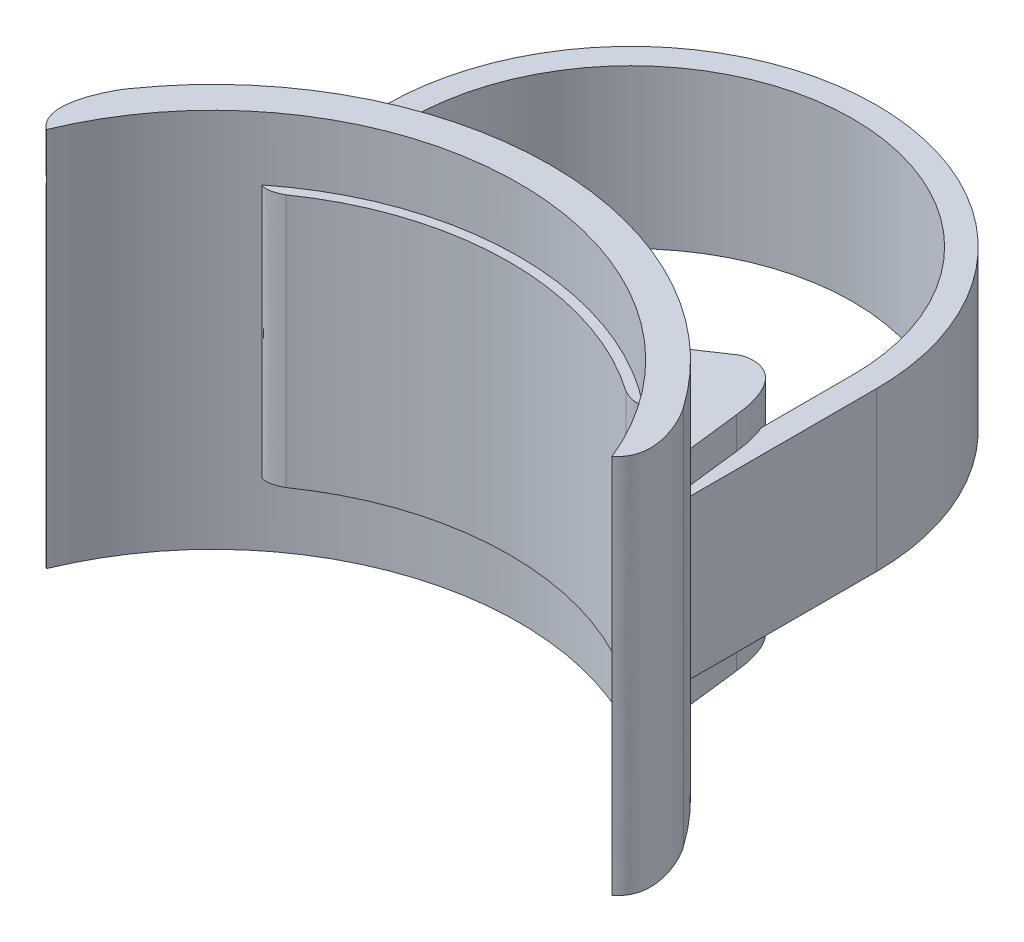
ISO-10303-21;
HEADER;
FILE_DESCRIPTION(('STEP AP214'),'2;1');
FILE_NAME('part.step','',(''),(''),'','','');
FILE_SCHEMA(('AUTOMOTIVE_DESIGN { 1 0 10303 214 1 1 1 1 }'));
ENDSEC;
DATA;
#1=APPLICATION_CONTEXT('core data for automotive mechanical design processes');
#2=APPLICATION_PROTOCOL_DEFINITION('international standard','automotive_design',2000,#1);
#3=PRODUCT_CONTEXT('',#1,'mechanical');
#4=PRODUCT('Part','Part','',(#3));
#5=PRODUCT_RELATED_PRODUCT_CATEGORY('part','',(#4));
#6=PRODUCT_DEFINITION_FORMATION('','',#4);
#7=PRODUCT_DEFINITION_CONTEXT('part definition',#1,'design');
#8=PRODUCT_DEFINITION('design','',#6,#7);
#9=PRODUCT_DEFINITION_SHAPE('','',#8);
#10=(LENGTH_UNIT() NAMED_UNIT(*) SI_UNIT(.MILLI.,.METRE.));
#11=(NAMED_UNIT(*) PLANE_ANGLE_UNIT() SI_UNIT($,.RADIAN.));
#12=(NAMED_UNIT(*) SI_UNIT($,.STERADIAN.) SOLID_ANGLE_UNIT());
#13=UNCERTAINTY_MEASURE_WITH_UNIT(LENGTH_MEASURE(1.E-05),#10,'distance_accuracy_value','');
#14=(GEOMETRIC_REPRESENTATION_CONTEXT(3) GLOBAL_UNCERTAINTY_ASSIGNED_CONTEXT((#13)) GLOBAL_UNIT_ASSIGNED_CONTEXT((#10,
#11,#12)) REPRESENTATION_CONTEXT('',''));
#15=CARTESIAN_POINT('',(0.,0.,0.));
#16=DIRECTION('',(0.,0.,1.));
#17=DIRECTION('',(1.,0.,0.));
#18=AXIS2_PLACEMENT_3D('',#15,#16,#17);
#19=CARTESIAN_POINT('',(0.,6.,0.));
#20=DIRECTION('',(0.,-1.,0.));
#21=DIRECTION('',(0.,0.,-1.));
#22=AXIS2_PLACEMENT_3D('',#19,#20,#21);
#23=CYLINDRICAL_SURFACE('',#22,9.65);
#24=CARTESIAN_POINT('',(0.,-6.,0.));
#25=DIRECTION('',(0.,-1.,0.));
#26=DIRECTION('',(0.,0.,1.));
#27=AXIS2_PLACEMENT_3D('',#24,#25,#26);
#28=CIRCLE('',#27,9.65);
#29=CARTESIAN_POINT('',(-8.92789337007722,-6.,-3.66267934339483));
#30=VERTEX_POINT('',#29);
#31=CARTESIAN_POINT('',(8.92789337007722,-6.,-3.66267934339483));
#32=VERTEX_POINT('',#31);
#33=EDGE_CURVE('E449',#30,#32,#28,.T.);
#34=ORIENTED_EDGE('',*,*,#33,.T.);
#35=DIRECTION('',(0.,-1.,0.));
#36=VECTOR('',#35,1.);
#37=CARTESIAN_POINT('',(8.92789337007722,6.,-3.66267934339483));
#38=LINE('',#37,#36);
#39=CARTESIAN_POINT('',(8.92789337007722,6.,-3.66267934339483));
#40=VERTEX_POINT('',#39);
#41=EDGE_CURVE('E448',#40,#32,#38,.T.);
#42=ORIENTED_EDGE('',*,*,#41,.F.);
#43=CARTESIAN_POINT('',(0.,6.,0.));
#44=DIRECTION('',(0.,-1.,0.));
#45=DIRECTION('',(0.,0.,1.));
#46=AXIS2_PLACEMENT_3D('',#43,#44,#45);
#47=CIRCLE('',#46,9.65);
#48=CARTESIAN_POINT('',(-8.92789337007722,6.,-3.66267934339483));
#49=VERTEX_POINT('',#48);
#50=EDGE_CURVE('E414',#49,#40,#47,.T.);
#51=ORIENTED_EDGE('',*,*,#50,.F.);
#52=DIRECTION('',(0.,-1.,0.));
#53=VECTOR('',#52,1.);
#54=CARTESIAN_POINT('',(-8.92789337007722,6.,-3.66267934339483));
#55=LINE('',#54,#53);
#56=EDGE_CURVE('E454',#49,#30,#55,.T.);
#57=ORIENTED_EDGE('',*,*,#56,.T.);
#58=EDGE_LOOP('',(#34,#42,#51,#57));
#59=FACE_BOUND('',#58,.T.);
#60=CARTESIAN_POINT('',(0.,4.,0.));
#61=DIRECTION('',(0.,1.,0.));
#62=DIRECTION('',(0.,0.,1.));
#63=AXIS2_PLACEMENT_3D('',#60,#61,#62);
#64=CIRCLE('',#63,9.65);
#65=CARTESIAN_POINT('',(6.01329510591382,4.,-7.54736920848536));
#66=VERTEX_POINT('',#65);
#67=CARTESIAN_POINT('',(-6.01329510591382,4.,-7.54736920848536));
#68=VERTEX_POINT('',#67);
#69=EDGE_CURVE('E66',#66,#68,#64,.T.);
#70=ORIENTED_EDGE('',*,*,#69,.F.);
#71=DIRECTION('',(0.,-1.,0.));
#72=VECTOR('',#71,1.);
#73=CARTESIAN_POINT('',(6.01329510591382,4.,-7.54736920848536));
#74=LINE('',#73,#72);
#75=CARTESIAN_POINT('',(6.01329510591382,-4.,-7.54736920848536));
#76=VERTEX_POINT('',#75);
#77=EDGE_CURVE('E257',#66,#76,#74,.T.);
#78=ORIENTED_EDGE('',*,*,#77,.T.);
#79=CARTESIAN_POINT('',(0.,-4.,0.));
#80=DIRECTION('',(0.,1.,0.));
#81=DIRECTION('',(0.,0.,1.));
#82=AXIS2_PLACEMENT_3D('',#79,#80,#81);
#83=CIRCLE('',#82,9.65);
#84=CARTESIAN_POINT('',(-6.01329510591382,-4.,-7.54736920848536));
#85=VERTEX_POINT('',#84);
#86=EDGE_CURVE('E246',#76,#85,#83,.T.);
#87=ORIENTED_EDGE('',*,*,#86,.T.);
#88=DIRECTION('',(0.,-1.,0.));
#89=VECTOR('',#88,1.);
#90=CARTESIAN_POINT('',(-6.01329510591381,4.,-7.54736920848536));
#91=LINE('',#90,#89);
#92=EDGE_CURVE('E65',#68,#85,#91,.T.);
#93=ORIENTED_EDGE('',*,*,#92,.F.);
#94=EDGE_LOOP('',(#70,#78,#87,#93));
#95=FACE_BOUND('',#94,.T.);
#96=ADVANCED_FACE('F42',(#59,#95),#23,.F.);
#97=CARTESIAN_POINT('',(0.,6.,0.));
#98=DIRECTION('',(0.,-1.,0.));
#99=DIRECTION('',(0.,0.,-1.));
#100=AXIS2_PLACEMENT_3D('',#97,#98,#99);
#101=CYLINDRICAL_SURFACE('',#100,10.65);
#102=CARTESIAN_POINT('',(0.,-6.,0.));
#103=DIRECTION('',(0.,1.,0.));
#104=DIRECTION('',(0.,0.,1.));
#105=AXIS2_PLACEMENT_3D('',#102,#103,#104);
#106=CIRCLE('',#105,10.65);
#107=CARTESIAN_POINT('',(8.72491438877498,-6.,-6.1072390577533));
#108=VERTEX_POINT('',#107);
#109=CARTESIAN_POINT('',(-8.72491438877497,-6.,-6.1072390577533));
#110=VERTEX_POINT('',#109);
#111=EDGE_CURVE('E416',#108,#110,#106,.T.);
#112=ORIENTED_EDGE('',*,*,#111,.T.);
#113=DIRECTION('',(0.,-1.,0.));
#114=VECTOR('',#113,1.);
#115=CARTESIAN_POINT('',(-8.72491438877497,6.,-6.1072390577533));
#116=LINE('',#115,#114);
#117=CARTESIAN_POINT('',(-8.72491438877497,6.,-6.1072390577533));
#118=VERTEX_POINT('',#117);
#119=EDGE_CURVE('E471',#118,#110,#116,.T.);
#120=ORIENTED_EDGE('',*,*,#119,.F.);
#121=CARTESIAN_POINT('',(0.,6.,0.));
#122=DIRECTION('',(0.,1.,0.));
#123=DIRECTION('',(0.,0.,1.));
#124=AXIS2_PLACEMENT_3D('',#121,#122,#123);
#125=CIRCLE('',#124,10.65);
#126=CARTESIAN_POINT('',(8.72491438877498,6.,-6.1072390577533));
#127=VERTEX_POINT('',#126);
#128=EDGE_CURVE('E428',#127,#118,#125,.T.);
#129=ORIENTED_EDGE('',*,*,#128,.F.);
#130=DIRECTION('',(0.,-1.,0.));
#131=VECTOR('',#130,1.);
#132=CARTESIAN_POINT('',(8.72491438877498,6.,-6.1072390577533));
#133=LINE('',#132,#131);
#134=EDGE_CURVE('E465',#127,#108,#133,.T.);
#135=ORIENTED_EDGE('',*,*,#134,.T.);
#136=EDGE_LOOP('',(#112,#120,#129,#135));
#137=FACE_BOUND('',#136,.T.);
#138=CARTESIAN_POINT('',(0.,3.5,0.));
#139=DIRECTION('',(0.,1.,0.));
#140=DIRECTION('',(0.,0.,1.));
#141=AXIS2_PLACEMENT_3D('',#138,#139,#140);
#142=CIRCLE('',#141,10.65);
#143=CARTESIAN_POINT('',(-4.05139613421545,3.5,-9.84929892752089));
#144=VERTEX_POINT('',#143);
#145=CARTESIAN_POINT('',(-7.44997939610248,3.5,-7.61053920544718));
#146=VERTEX_POINT('',#145);
#147=EDGE_CURVE('E575',#144,#146,#142,.T.);
#148=ORIENTED_EDGE('',*,*,#147,.T.);
#149=DIRECTION('',(0.,-1.,0.));
#150=VECTOR('',#149,1.);
#151=CARTESIAN_POINT('',(-7.44997939610248,3.5,-7.61053920544718));
#152=LINE('',#151,#150);
#153=CARTESIAN_POINT('',(-7.44997939610248,2.5,-7.61053920544718));
#154=VERTEX_POINT('',#153);
#155=EDGE_CURVE('E568',#146,#154,#152,.T.);
#156=ORIENTED_EDGE('',*,*,#155,.T.);
#157=CARTESIAN_POINT('',(0.,2.5,0.));
#158=DIRECTION('',(0.,1.,0.));
#159=DIRECTION('',(0.,0.,1.));
#160=AXIS2_PLACEMENT_3D('',#157,#158,#159);
#161=CIRCLE('',#160,10.65);
#162=CARTESIAN_POINT('',(-7.75,2.5,-7.30479294709987));
#163=VERTEX_POINT('',#162);
#164=EDGE_CURVE('E484',#154,#163,#161,.T.);
#165=ORIENTED_EDGE('',*,*,#164,.T.);
#166=DIRECTION('',(0.,-1.,0.));
#167=VECTOR('',#166,1.);
#168=CARTESIAN_POINT('',(-7.75,6.,-7.30479294709987));
#169=LINE('',#168,#167);
#170=CARTESIAN_POINT('',(-7.75,-2.5,-7.30479294709987));
#171=VERTEX_POINT('',#170);
#172=EDGE_CURVE('E481',#171,#163,#169,.F.);
#173=ORIENTED_EDGE('',*,*,#172,.F.);
#174=CARTESIAN_POINT('',(0.,-2.5,0.));
#175=DIRECTION('',(0.,1.,0.));
#176=DIRECTION('',(0.,0.,1.));
#177=AXIS2_PLACEMENT_3D('',#174,#175,#176);
#178=CIRCLE('',#177,10.65);
#179=CARTESIAN_POINT('',(-7.44997939610248,-2.5,-7.61053920544718));
#180=VERTEX_POINT('',#179);
#181=EDGE_CURVE('E478',#180,#171,#178,.T.);
#182=ORIENTED_EDGE('',*,*,#181,.F.);
#183=CARTESIAN_POINT('',(-7.44997939610248,-3.5,-7.61053920544718));
#184=VERTEX_POINT('',#183);
#185=EDGE_CURVE('E511',#180,#184,#152,.T.);
#186=ORIENTED_EDGE('',*,*,#185,.T.);
#187=CARTESIAN_POINT('',(0.,-3.5,0.));
#188=DIRECTION('',(0.,1.,0.));
#189=DIRECTION('',(0.,0.,1.));
#190=AXIS2_PLACEMENT_3D('',#187,#188,#189);
#191=CIRCLE('',#190,10.65);
#192=CARTESIAN_POINT('',(-4.05139613421545,-3.5,-9.84929892752089));
#193=VERTEX_POINT('',#192);
#194=EDGE_CURVE('E584',#193,#184,#191,.T.);
#195=ORIENTED_EDGE('',*,*,#194,.F.);
#196=DIRECTION('',(0.,-1.,0.));
#197=VECTOR('',#196,1.);
#198=CARTESIAN_POINT('',(-4.05139613421545,3.5,-9.84929892752089));
#199=LINE('',#198,#197);
#200=EDGE_CURVE('E574',#144,#193,#199,.T.);
#201=ORIENTED_EDGE('',*,*,#200,.F.);
#202=EDGE_LOOP('',(#148,#156,#165,#173,#182,#186,#195,#201));
#203=FACE_BOUND('',#202,.T.);
#204=DIRECTION('',(0.,-1.,0.));
#205=VECTOR('',#204,1.);
#206=CARTESIAN_POINT('',(7.44997939610248,3.5,-7.61053920544718));
#207=LINE('',#206,#205);
#208=CARTESIAN_POINT('',(7.44997939610248,3.5,-7.61053920544718));
#209=VERTEX_POINT('',#208);
#210=CARTESIAN_POINT('',(7.44997939610248,2.5,-7.61053920544718));
#211=VERTEX_POINT('',#210);
#212=EDGE_CURVE('E329',#209,#211,#207,.T.);
#213=ORIENTED_EDGE('',*,*,#212,.F.);
#214=CARTESIAN_POINT('',(0.,3.5,0.));
#215=DIRECTION('',(0.,1.,0.));
#216=DIRECTION('',(0.,0.,1.));
#217=AXIS2_PLACEMENT_3D('',#214,#215,#216);
#218=CIRCLE('',#217,10.65);
#219=CARTESIAN_POINT('',(4.05139613421545,3.5,-9.84929892752089));
#220=VERTEX_POINT('',#219);
#221=EDGE_CURVE('E313',#220,#209,#218,.F.);
#222=ORIENTED_EDGE('',*,*,#221,.F.);
#223=DIRECTION('',(0.,-1.,0.));
#224=VECTOR('',#223,1.);
#225=CARTESIAN_POINT('',(4.05139613421545,3.5,-9.84929892752089));
#226=LINE('',#225,#224);
#227=CARTESIAN_POINT('',(4.05139613421545,-3.5,-9.84929892752089));
#228=VERTEX_POINT('',#227);
#229=EDGE_CURVE('E332',#220,#228,#226,.T.);
#230=ORIENTED_EDGE('',*,*,#229,.T.);
#231=CARTESIAN_POINT('',(0.,-3.5,0.));
#232=DIRECTION('',(0.,1.,0.));
#233=DIRECTION('',(0.,0.,1.));
#234=AXIS2_PLACEMENT_3D('',#231,#232,#233);
#235=CIRCLE('',#234,10.65);
#236=CARTESIAN_POINT('',(7.44997939610248,-3.5,-7.61053920544718));
#237=VERTEX_POINT('',#236);
#238=EDGE_CURVE('E327',#228,#237,#235,.F.);
#239=ORIENTED_EDGE('',*,*,#238,.T.);
#240=CARTESIAN_POINT('',(7.44997939610248,-2.5,-7.61053920544718));
#241=VERTEX_POINT('',#240);
#242=EDGE_CURVE('E317',#241,#237,#207,.T.);
#243=ORIENTED_EDGE('',*,*,#242,.F.);
#244=CARTESIAN_POINT('',(7.75,-2.5,-7.30479294709987));
#245=VERTEX_POINT('',#244);
#246=EDGE_CURVE('E485',#245,#241,#178,.T.);
#247=ORIENTED_EDGE('',*,*,#246,.F.);
#248=DIRECTION('',(0.,-1.,0.));
#249=VECTOR('',#248,1.);
#250=CARTESIAN_POINT('',(7.75,6.,-7.30479294709987));
#251=LINE('',#250,#249);
#252=CARTESIAN_POINT('',(7.75,2.5,-7.30479294709987));
#253=VERTEX_POINT('',#252);
#254=EDGE_CURVE('E486',#253,#245,#251,.T.);
#255=ORIENTED_EDGE('',*,*,#254,.F.);
#256=EDGE_CURVE('E487',#253,#211,#161,.T.);
#257=ORIENTED_EDGE('',*,*,#256,.T.);
#258=EDGE_LOOP('',(#213,#222,#230,#239,#243,#247,#255,#257));
#259=FACE_BOUND('',#258,.T.);
#260=ADVANCED_FACE('F440',(#137,#203,#259),#101,.T.);
#261=CARTESIAN_POINT('',(7.,2.5,-6.97677392120415));
#262=DIRECTION('',(1.,0.,0.));
#263=DIRECTION('',(0.,0.,-1.));
#264=AXIS2_PLACEMENT_3D('',#261,#262,#263);
#265=PLANE('',#264);
#266=DIRECTION('',(0.,-1.,0.));
#267=VECTOR('',#266,1.);
#268=CARTESIAN_POINT('',(7.,3.5,-10.2833206239546));
#269=LINE('',#268,#267);
#270=CARTESIAN_POINT('',(7.,2.5,-10.2833206221912));
#271=VERTEX_POINT('',#270);
#272=CARTESIAN_POINT('',(7.,-2.5,-10.2833206221912));
#273=VERTEX_POINT('',#272);
#274=EDGE_CURVE('E345',#271,#273,#269,.T.);
#275=ORIENTED_EDGE('',*,*,#274,.F.);
#276=DIRECTION('',(0.,0.,1.));
#277=VECTOR('',#276,1.);
#278=CARTESIAN_POINT('',(7.,2.5,-6.97677392120415));
#279=LINE('',#278,#277);
#280=CARTESIAN_POINT('',(7.,2.5,-13.1800556274848));
#281=VERTEX_POINT('',#280);
#282=EDGE_CURVE('E378',#281,#271,#279,.T.);
#283=ORIENTED_EDGE('',*,*,#282,.F.);
#284=DIRECTION('',(0.,-1.,0.));
#285=VECTOR('',#284,1.);
#286=CARTESIAN_POINT('',(7.,2.5,-13.1800556274848));
#287=LINE('',#286,#285);
#288=CARTESIAN_POINT('',(7.,-2.5,-13.1800556274848));
#289=VERTEX_POINT('',#288);
#290=EDGE_CURVE('E399',#281,#289,#287,.T.);
#291=ORIENTED_EDGE('',*,*,#290,.T.);
#292=DIRECTION('',(0.,0.,1.));
#293=VECTOR('',#292,1.);
#294=CARTESIAN_POINT('',(7.,-2.5,-6.97677392120415));
#295=LINE('',#294,#293);
#296=EDGE_CURVE('E393',#289,#273,#295,.T.);
#297=ORIENTED_EDGE('',*,*,#296,.T.);
#298=EDGE_LOOP('',(#275,#283,#291,#297));
#299=FACE_BOUND('',#298,.T.);
#300=ADVANCED_FACE('F443',(#299),#265,.F.);
#301=CARTESIAN_POINT('',(0.,2.5,-13.1800556274848));
#302=DIRECTION('',(0.,1.,0.));
#303=DIRECTION('',(0.,0.,1.));
#304=AXIS2_PLACEMENT_3D('',#301,#302,#303);
#305=PLANE('',#304);
#306=CARTESIAN_POINT('',(-7.2561192201253,2.5,-9.25499268157137));
#307=CARTESIAN_POINT('',(-7.04158385142521,2.5,-11.2062429397485));
#308=CARTESIAN_POINT('',(-5.98153875974547,2.5,-11.097373504488));
#309=CARTESIAN_POINT('',(-5.63788790527143,2.5,-10.914088423568));
#310=B_SPLINE_CURVE_WITH_KNOTS('',3,(#306,#307,#308,#309),.UNSPECIFIED.,.F.,.F.,(4,4),(0.,1.),.UNSPECIFIED.);
#311=CARTESIAN_POINT('',(-7.,2.5,-10.2833206239546));
#312=VERTEX_POINT('',#311);
#313=CARTESIAN_POINT('',(-7.25611922012531,2.5,-9.25499268157137));
#314=VERTEX_POINT('',#313);
#315=EDGE_CURVE('E359',#312,#314,#310,.F.);
#316=ORIENTED_EDGE('',*,*,#315,.F.);
#317=DIRECTION('',(0.,0.,-1.));
#318=VECTOR('',#317,1.);
#319=CARTESIAN_POINT('',(-7.,2.5,-6.97677392120415));
#320=LINE('',#319,#318);
#321=CARTESIAN_POINT('',(-7.,2.5,-13.1800556274848));
#322=VERTEX_POINT('',#321);
#323=EDGE_CURVE('E374',#312,#322,#320,.T.);
#324=ORIENTED_EDGE('',*,*,#323,.T.);
#325=CARTESIAN_POINT('',(0.,2.5,-13.1800556274848));
#326=DIRECTION('',(0.,-1.,0.));
#327=DIRECTION('',(0.,0.,1.));
#328=AXIS2_PLACEMENT_3D('',#325,#326,#327);
#329=CIRCLE('',#328,7.);
#330=EDGE_CURVE('E380',#322,#281,#329,.T.);
#331=ORIENTED_EDGE('',*,*,#330,.T.);
#332=ORIENTED_EDGE('',*,*,#282,.T.);
#333=CARTESIAN_POINT('',(7.2561192201253,2.5,-9.25499268157137));
#334=CARTESIAN_POINT('',(7.04158385142521,2.5,-11.2062429397485));
#335=CARTESIAN_POINT('',(5.98153875974547,2.5,-11.097373504488));
#336=CARTESIAN_POINT('',(5.63788790527143,2.5,-10.914088423568));
#337=B_SPLINE_CURVE_WITH_KNOTS('',3,(#333,#334,#335,#336),.UNSPECIFIED.,.F.,.F.,(4,4),(0.,1.),.UNSPECIFIED.);
#338=CARTESIAN_POINT('',(7.2561192201253,2.5,-9.25499268157137));
#339=VERTEX_POINT('',#338);
#340=EDGE_CURVE('E343',#271,#339,#337,.F.);
#341=ORIENTED_EDGE('',*,*,#340,.T.);
#342=DIRECTION('',(0.117076573550394,0.,0.993122890646318));
#343=VECTOR('',#342,1.);
#344=CARTESIAN_POINT('',(6.70028748237093,2.5,-13.9699344104903));
#345=LINE('',#344,#343);
#346=EDGE_CURVE('E349',#339,#211,#345,.T.);
#347=ORIENTED_EDGE('',*,*,#346,.T.);
#348=ORIENTED_EDGE('',*,*,#256,.F.);
#349=DIRECTION('',(0.,0.,-1.));
#350=VECTOR('',#349,1.);
#351=CARTESIAN_POINT('',(7.75,2.5,-13.1800556274848));
#352=LINE('',#351,#350);
#353=CARTESIAN_POINT('',(7.75,2.5,-13.1800556274848));
#354=VERTEX_POINT('',#353);
#355=EDGE_CURVE('E385',#253,#354,#352,.T.);
#356=ORIENTED_EDGE('',*,*,#355,.T.);
#357=CARTESIAN_POINT('',(0.,2.5,-13.1800556274848));
#358=DIRECTION('',(0.,1.,0.));
#359=DIRECTION('',(0.,0.,1.));
#360=AXIS2_PLACEMENT_3D('',#357,#358,#359);
#361=CIRCLE('',#360,7.75);
#362=CARTESIAN_POINT('',(-7.75,2.5,-13.1800556274848));
#363=VERTEX_POINT('',#362);
#364=EDGE_CURVE('E362',#354,#363,#361,.T.);
#365=ORIENTED_EDGE('',*,*,#364,.T.);
#366=DIRECTION('',(0.,0.,1.));
#367=VECTOR('',#366,1.);
#368=CARTESIAN_POINT('',(-7.75,2.5,-13.1800556274848));
#369=LINE('',#368,#367);
#370=EDGE_CURVE('E371',#363,#163,#369,.T.);
#371=ORIENTED_EDGE('',*,*,#370,.T.);
#372=ORIENTED_EDGE('',*,*,#164,.F.);
#373=DIRECTION('',(-0.117076573550394,0.,0.993122890646318));
#374=VECTOR('',#373,1.);
#375=CARTESIAN_POINT('',(-6.70028748237093,2.5,-13.9699344104903));
#376=LINE('',#375,#374);
#377=EDGE_CURVE('E354',#314,#154,#376,.T.);
#378=ORIENTED_EDGE('',*,*,#377,.F.);
#379=EDGE_LOOP('',(#316,#324,#331,#332,#341,#347,#348,#356,#365,#371,#372,#378));
#380=FACE_BOUND('',#379,.T.);
#381=ADVANCED_FACE('F534',(#380),#305,.T.);
#382=CARTESIAN_POINT('',(0.,-2.5,-13.1800556274848));
#383=DIRECTION('',(0.,1.,0.));
#384=DIRECTION('',(0.,0.,1.));
#385=AXIS2_PLACEMENT_3D('',#382,#383,#384);
#386=PLANE('',#385);
#387=DIRECTION('',(0.,0.,-1.));
#388=VECTOR('',#387,1.);
#389=CARTESIAN_POINT('',(-7.,-2.5,-6.97677392120415));
#390=LINE('',#389,#388);
#391=CARTESIAN_POINT('',(-7.00000000081063,-2.5,-10.2833206221912));
#392=VERTEX_POINT('',#391);
#393=CARTESIAN_POINT('',(-7.,-2.5,-13.1800556274848));
#394=VERTEX_POINT('',#393);
#395=EDGE_CURVE('E388',#392,#394,#390,.T.);
#396=ORIENTED_EDGE('',*,*,#395,.F.);
#397=CARTESIAN_POINT('',(-7.2561192201253,-2.5,-9.25499268157137));
#398=CARTESIAN_POINT('',(-7.04158385142521,-2.5,-11.2062429397485));
#399=CARTESIAN_POINT('',(-5.98153875974547,-2.5,-11.097373504488));
#400=CARTESIAN_POINT('',(-5.63788790527143,-2.5,-10.914088423568));
#401=B_SPLINE_CURVE_WITH_KNOTS('',3,(#397,#398,#399,#400),.UNSPECIFIED.,.F.,.F.,(4,4),(0.,1.),.UNSPECIFIED.);
#402=CARTESIAN_POINT('',(-7.25611922012531,-2.5,-9.25499268157137));
#403=VERTEX_POINT('',#402);
#404=EDGE_CURVE('E11',#392,#403,#401,.F.);
#405=ORIENTED_EDGE('',*,*,#404,.T.);
#406=DIRECTION('',(-0.117076573550394,0.,0.993122890646318));
#407=VECTOR('',#406,1.);
#408=CARTESIAN_POINT('',(-6.70028748237093,-2.5,-13.9699344104903));
#409=LINE('',#408,#407);
#410=EDGE_CURVE('E54',#403,#180,#409,.T.);
#411=ORIENTED_EDGE('',*,*,#410,.T.);
#412=ORIENTED_EDGE('',*,*,#181,.T.);
#413=DIRECTION('',(0.,0.,1.));
#414=VECTOR('',#413,1.);
#415=CARTESIAN_POINT('',(-7.75,-2.5,-13.1800556274848));
#416=LINE('',#415,#414);
#417=CARTESIAN_POINT('',(-7.75,-2.5,-13.1800556274848));
#418=VERTEX_POINT('',#417);
#419=EDGE_CURVE('E390',#418,#171,#416,.T.);
#420=ORIENTED_EDGE('',*,*,#419,.F.);
#421=CARTESIAN_POINT('',(0.,-2.5,-13.1800556274848));
#422=DIRECTION('',(0.,1.,0.));
#423=DIRECTION('',(0.,0.,1.));
#424=AXIS2_PLACEMENT_3D('',#421,#422,#423);
#425=CIRCLE('',#424,7.75);
#426=CARTESIAN_POINT('',(7.75,-2.5,-13.1800556274848));
#427=VERTEX_POINT('',#426);
#428=EDGE_CURVE('E364',#427,#418,#425,.T.);
#429=ORIENTED_EDGE('',*,*,#428,.F.);
#430=DIRECTION('',(0.,0.,-1.));
#431=VECTOR('',#430,1.);
#432=CARTESIAN_POINT('',(7.75,-2.5,-13.1800556274848));
#433=LINE('',#432,#431);
#434=EDGE_CURVE('E375',#245,#427,#433,.T.);
#435=ORIENTED_EDGE('',*,*,#434,.F.);
#436=ORIENTED_EDGE('',*,*,#246,.T.);
#437=DIRECTION('',(0.117076573550394,0.,0.993122890646318));
#438=VECTOR('',#437,1.);
#439=CARTESIAN_POINT('',(6.70028748237093,-2.5,-13.9699344104903));
#440=LINE('',#439,#438);
#441=CARTESIAN_POINT('',(7.25611922012531,-2.5,-9.25499268157137));
#442=VERTEX_POINT('',#441);
#443=EDGE_CURVE('E496',#442,#241,#440,.T.);
#444=ORIENTED_EDGE('',*,*,#443,.F.);
#445=CARTESIAN_POINT('',(7.2561192201253,-2.5,-9.25499268157137));
#446=CARTESIAN_POINT('',(7.04158385142521,-2.5,-11.2062429397485));
#447=CARTESIAN_POINT('',(5.98153875974547,-2.5,-11.097373504488));
#448=CARTESIAN_POINT('',(5.63788790527143,-2.5,-10.914088423568));
#449=B_SPLINE_CURVE_WITH_KNOTS('',3,(#445,#446,#447,#448),.UNSPECIFIED.,.F.,.F.,(4,4),(0.,1.),.UNSPECIFIED.);
#450=EDGE_CURVE('E493',#273,#442,#449,.F.);
#451=ORIENTED_EDGE('',*,*,#450,.F.);
#452=ORIENTED_EDGE('',*,*,#296,.F.);
#453=CARTESIAN_POINT('',(0.,-2.5,-13.1800556274848));
#454=DIRECTION('',(0.,-1.,0.));
#455=DIRECTION('',(0.,0.,1.));
#456=AXIS2_PLACEMENT_3D('',#453,#454,#455);
#457=CIRCLE('',#456,7.);
#458=EDGE_CURVE('E395',#394,#289,#457,.T.);
#459=ORIENTED_EDGE('',*,*,#458,.F.);
#460=EDGE_LOOP('',(#396,#405,#411,#412,#420,#429,#435,#436,#444,#451,#452,#459));
#461=FACE_BOUND('',#460,.T.);
#462=ADVANCED_FACE('F504',(#461),#386,.F.);
#463=CARTESIAN_POINT('',(-8.72491438877498,6.,-6.1072390577533));
#464=CARTESIAN_POINT('',(-8.90485878840378,6.,-5.8938610343217));
#465=CARTESIAN_POINT('',(-9.80345898938828,6.,-4.32257182668029));
#466=CARTESIAN_POINT('',(-8.92789337007722,6.,-3.66267934339483));
#467=B_SPLINE_CURVE_WITH_KNOTS('',3,(#463,#464,#465,#466),.UNSPECIFIED.,.F.,.F.,(4,4),(0.,1.),.UNSPECIFIED.);
#468=DIRECTION('',(0.,-1.,0.));
#469=VECTOR('',#468,1.);
#470=SURFACE_OF_LINEAR_EXTRUSION('',#467,#469);
#471=CARTESIAN_POINT('',(-8.72491438877498,-6.,-6.1072390577533));
#472=CARTESIAN_POINT('',(-8.90485878840378,-6.,-5.8938610343217));
#473=CARTESIAN_POINT('',(-9.80345898938828,-6.,-4.32257182668029));
#474=CARTESIAN_POINT('',(-8.92789337007722,-6.,-3.66267934339483));
#475=B_SPLINE_CURVE_WITH_KNOTS('',3,(#471,#472,#473,#474),.UNSPECIFIED.,.F.,.F.,(4,4),(0.,1.),.UNSPECIFIED.);
#476=EDGE_CURVE('E409',#110,#30,#475,.T.);
#477=ORIENTED_EDGE('',*,*,#476,.T.);
#478=ORIENTED_EDGE('',*,*,#56,.F.);
#479=EDGE_CURVE('E406',#118,#49,#467,.T.);
#480=ORIENTED_EDGE('',*,*,#479,.F.);
#481=ORIENTED_EDGE('',*,*,#119,.T.);
#482=EDGE_LOOP('',(#477,#478,#480,#481));
#483=FACE_BOUND('',#482,.T.);
#484=ADVANCED_FACE('F46',(#483),#470,.F.);
#485=CARTESIAN_POINT('',(8.92789337007722,6.,-3.66267934339483));
#486=CARTESIAN_POINT('',(9.80345898938828,6.,-4.32257182668029));
#487=CARTESIAN_POINT('',(8.90485878840378,6.,-5.8938610343217));
#488=CARTESIAN_POINT('',(8.72491438877498,6.,-6.1072390577533));
#489=B_SPLINE_CURVE_WITH_KNOTS('',3,(#485,#486,#487,#488),.UNSPECIFIED.,.F.,.F.,(4,4),(0.,1.),.UNSPECIFIED.);
#490=DIRECTION('',(0.,-1.,0.));
#491=VECTOR('',#490,1.);
#492=SURFACE_OF_LINEAR_EXTRUSION('',#489,#491);
#493=CARTESIAN_POINT('',(8.92789337007722,-6.,-3.66267934339483));
#494=CARTESIAN_POINT('',(9.80345898938828,-6.,-4.32257182668029));
#495=CARTESIAN_POINT('',(8.90485878840378,-6.,-5.8938610343217));
#496=CARTESIAN_POINT('',(8.72491438877498,-6.,-6.1072390577533));
#497=B_SPLINE_CURVE_WITH_KNOTS('',3,(#493,#494,#495,#496),.UNSPECIFIED.,.F.,.F.,(4,4),(0.,1.),.UNSPECIFIED.);
#498=EDGE_CURVE('E457',#32,#108,#497,.T.);
#499=ORIENTED_EDGE('',*,*,#498,.T.);
#500=ORIENTED_EDGE('',*,*,#134,.F.);
#501=EDGE_CURVE('E423',#40,#127,#489,.T.);
#502=ORIENTED_EDGE('',*,*,#501,.F.);
#503=ORIENTED_EDGE('',*,*,#41,.T.);
#504=EDGE_LOOP('',(#499,#500,#502,#503));
#505=FACE_BOUND('',#504,.T.);
#506=ADVANCED_FACE('F435',(#505),#492,.F.);
#507=CARTESIAN_POINT('',(-9.22222013652855,6.,-5.05240212301926));
#508=DIRECTION('',(0.,-1.,0.));
#509=DIRECTION('',(0.,0.,-1.));
#510=AXIS2_PLACEMENT_3D('',#507,#508,#509);
#511=PLANE('',#510);
#512=ORIENTED_EDGE('',*,*,#479,.T.);
#513=ORIENTED_EDGE('',*,*,#50,.T.);
#514=ORIENTED_EDGE('',*,*,#501,.T.);
#515=ORIENTED_EDGE('',*,*,#128,.T.);
#516=EDGE_LOOP('',(#512,#513,#514,#515));
#517=FACE_BOUND('',#516,.T.);
#518=ADVANCED_FACE('F434',(#517),#511,.F.);
#519=CARTESIAN_POINT('',(-9.22222013652855,-6.,-5.05240212301926));
#520=DIRECTION('',(0.,-1.,0.));
#521=DIRECTION('',(0.,0.,-1.));
#522=AXIS2_PLACEMENT_3D('',#519,#520,#521);
#523=PLANE('',#522);
#524=ORIENTED_EDGE('',*,*,#476,.F.);
#525=ORIENTED_EDGE('',*,*,#111,.F.);
#526=ORIENTED_EDGE('',*,*,#498,.F.);
#527=ORIENTED_EDGE('',*,*,#33,.F.);
#528=EDGE_LOOP('',(#524,#525,#526,#527));
#529=FACE_BOUND('',#528,.T.);
#530=ADVANCED_FACE('F464',(#529),#523,.T.);
#531=CARTESIAN_POINT('',(-7.75,2.5,-13.1800556274848));
#532=DIRECTION('',(1.,0.,0.));
#533=DIRECTION('',(0.,0.,-1.));
#534=AXIS2_PLACEMENT_3D('',#531,#532,#533);
#535=PLANE('',#534);
#536=ORIENTED_EDGE('',*,*,#419,.T.);
#537=ORIENTED_EDGE('',*,*,#172,.T.);
#538=ORIENTED_EDGE('',*,*,#370,.F.);
#539=DIRECTION('',(0.,-1.,0.));
#540=VECTOR('',#539,1.);
#541=CARTESIAN_POINT('',(-7.75,2.5,-13.1800556274848));
#542=LINE('',#541,#540);
#543=EDGE_CURVE('E407',#363,#418,#542,.T.);
#544=ORIENTED_EDGE('',*,*,#543,.T.);
#545=EDGE_LOOP('',(#536,#537,#538,#544));
#546=FACE_BOUND('',#545,.T.);
#547=ADVANCED_FACE('F519',(#546),#535,.F.);
#548=CARTESIAN_POINT('',(-7.,2.5,-6.97677392120415));
#549=DIRECTION('',(-1.,0.,0.));
#550=DIRECTION('',(0.,0.,1.));
#551=AXIS2_PLACEMENT_3D('',#548,#549,#550);
#552=PLANE('',#551);
#553=ORIENTED_EDGE('',*,*,#323,.F.);
#554=DIRECTION('',(0.,-1.,0.));
#555=VECTOR('',#554,1.);
#556=CARTESIAN_POINT('',(-7.,3.5,-10.2833206239546));
#557=LINE('',#556,#555);
#558=EDGE_CURVE('E357',#312,#392,#557,.T.);
#559=ORIENTED_EDGE('',*,*,#558,.T.);
#560=ORIENTED_EDGE('',*,*,#395,.T.);
#561=DIRECTION('',(0.,-1.,0.));
#562=VECTOR('',#561,1.);
#563=CARTESIAN_POINT('',(-7.,2.5,-13.1800556274848));
#564=LINE('',#563,#562);
#565=EDGE_CURVE('E401',#322,#394,#564,.T.);
#566=ORIENTED_EDGE('',*,*,#565,.F.);
#567=EDGE_LOOP('',(#553,#559,#560,#566));
#568=FACE_BOUND('',#567,.T.);
#569=ADVANCED_FACE('F563',(#568),#552,.F.);
#570=CARTESIAN_POINT('',(7.75,2.5,-13.1800556274848));
#571=DIRECTION('',(-1.,0.,0.));
#572=DIRECTION('',(0.,0.,1.));
#573=AXIS2_PLACEMENT_3D('',#570,#571,#572);
#574=PLANE('',#573);
#575=ORIENTED_EDGE('',*,*,#355,.F.);
#576=ORIENTED_EDGE('',*,*,#254,.T.);
#577=ORIENTED_EDGE('',*,*,#434,.T.);
#578=DIRECTION('',(0.,-1.,0.));
#579=VECTOR('',#578,1.);
#580=CARTESIAN_POINT('',(7.75,2.5,-13.1800556274848));
#581=LINE('',#580,#579);
#582=EDGE_CURVE('E381',#354,#427,#581,.T.);
#583=ORIENTED_EDGE('',*,*,#582,.F.);
#584=EDGE_LOOP('',(#575,#576,#577,#583));
#585=FACE_BOUND('',#584,.T.);
#586=ADVANCED_FACE('F528',(#585),#574,.F.);
#587=CARTESIAN_POINT('',(0.,2.5,-13.1800556274848));
#588=DIRECTION('',(0.,-1.,0.));
#589=DIRECTION('',(0.,0.,-1.));
#590=AXIS2_PLACEMENT_3D('',#587,#588,#589);
#591=CYLINDRICAL_SURFACE('',#590,7.75);
#592=ORIENTED_EDGE('',*,*,#428,.T.);
#593=ORIENTED_EDGE('',*,*,#543,.F.);
#594=ORIENTED_EDGE('',*,*,#364,.F.);
#595=ORIENTED_EDGE('',*,*,#582,.T.);
#596=EDGE_LOOP('',(#592,#593,#594,#595));
#597=FACE_BOUND('',#596,.T.);
#598=ADVANCED_FACE('F523',(#597),#591,.T.);
#599=CARTESIAN_POINT('',(0.,2.5,-13.1800556274848));
#600=DIRECTION('',(0.,-1.,0.));
#601=DIRECTION('',(0.,0.,-1.));
#602=AXIS2_PLACEMENT_3D('',#599,#600,#601);
#603=CYLINDRICAL_SURFACE('',#602,7.);
#604=ORIENTED_EDGE('',*,*,#458,.T.);
#605=ORIENTED_EDGE('',*,*,#290,.F.);
#606=ORIENTED_EDGE('',*,*,#330,.F.);
#607=ORIENTED_EDGE('',*,*,#565,.T.);
#608=EDGE_LOOP('',(#604,#605,#606,#607));
#609=FACE_BOUND('',#608,.T.);
#610=ADVANCED_FACE('F557',(#609),#603,.F.);
#611=CARTESIAN_POINT('',(8.23275133375244,3.5,-0.970536804786461));
#612=DIRECTION('',(-0.993122890646318,0.,0.117076573550394));
#613=DIRECTION('',(0.117076573550394,0.,0.993122890646318));
#614=AXIS2_PLACEMENT_3D('',#611,#612,#613);
#615=PLANE('',#614);
#616=DIRECTION('',(0.,-1.,0.));
#617=VECTOR('',#616,1.);
#618=CARTESIAN_POINT('',(7.25611922012531,3.5,-9.25499268157137));
#619=LINE('',#618,#617);
#620=CARTESIAN_POINT('',(7.25611922012531,-3.5,-9.25499268157137));
#621=VERTEX_POINT('',#620);
#622=EDGE_CURVE('E340',#442,#621,#619,.T.);
#623=ORIENTED_EDGE('',*,*,#622,.F.);
#624=ORIENTED_EDGE('',*,*,#443,.T.);
#625=ORIENTED_EDGE('',*,*,#242,.T.);
#626=DIRECTION('',(-0.117076573550394,0.,-0.993122890646318));
#627=VECTOR('',#626,1.);
#628=CARTESIAN_POINT('',(8.23275133375244,-3.5,-0.970536804786461));
#629=LINE('',#628,#627);
#630=EDGE_CURVE('E252',#237,#621,#629,.T.);
#631=ORIENTED_EDGE('',*,*,#630,.T.);
#632=EDGE_LOOP('',(#623,#624,#625,#631));
#633=FACE_BOUND('',#632,.T.);
#634=ADVANCED_FACE('F553',(#633),#615,.F.);
#635=ORIENTED_EDGE('',*,*,#346,.F.);
#636=CARTESIAN_POINT('',(7.25611922012531,3.5,-9.25499268157137));
#637=VERTEX_POINT('',#636);
#638=EDGE_CURVE('E336',#637,#339,#619,.T.);
#639=ORIENTED_EDGE('',*,*,#638,.F.);
#640=DIRECTION('',(-0.117076573550394,0.,-0.993122890646318));
#641=VECTOR('',#640,1.);
#642=CARTESIAN_POINT('',(8.23275133375244,3.5,-0.970536804786461));
#643=LINE('',#642,#641);
#644=EDGE_CURVE('E310',#209,#637,#643,.T.);
#645=ORIENTED_EDGE('',*,*,#644,.F.);
#646=ORIENTED_EDGE('',*,*,#212,.T.);
#647=EDGE_LOOP('',(#635,#639,#645,#646));
#648=FACE_BOUND('',#647,.T.);
#649=ADVANCED_FACE('F300',(#648),#615,.F.);
#650=CARTESIAN_POINT('',(7.2561192201253,3.5,-9.25499268157137));
#651=CARTESIAN_POINT('',(7.04158385142521,3.5,-11.2062429397485));
#652=CARTESIAN_POINT('',(5.98153875974547,3.5,-11.097373504488));
#653=CARTESIAN_POINT('',(5.63788790527143,3.5,-10.914088423568));
#654=B_SPLINE_CURVE_WITH_KNOTS('',3,(#650,#651,#652,#653),.UNSPECIFIED.,.F.,.F.,(4,4),(0.,1.),.UNSPECIFIED.);
#655=DIRECTION('',(0.,-1.,0.));
#656=VECTOR('',#655,1.);
#657=SURFACE_OF_LINEAR_EXTRUSION('',#654,#656);
#658=ORIENTED_EDGE('',*,*,#340,.F.);
#659=ORIENTED_EDGE('',*,*,#274,.T.);
#660=ORIENTED_EDGE('',*,*,#450,.T.);
#661=ORIENTED_EDGE('',*,*,#622,.T.);
#662=CARTESIAN_POINT('',(7.2561192201253,-3.5,-9.25499268157137));
#663=CARTESIAN_POINT('',(7.04158385142521,-3.5,-11.2062429397485));
#664=CARTESIAN_POINT('',(5.98153875974547,-3.5,-11.097373504488));
#665=CARTESIAN_POINT('',(5.63788790527143,-3.5,-10.914088423568));
#666=B_SPLINE_CURVE_WITH_KNOTS('',3,(#662,#663,#664,#665),.UNSPECIFIED.,.F.,.F.,(4,4),(0.,1.),.UNSPECIFIED.);
#667=CARTESIAN_POINT('',(5.63788790527143,-3.5,-10.914088423568));
#668=VERTEX_POINT('',#667);
#669=EDGE_CURVE('E251',#621,#668,#666,.T.);
#670=ORIENTED_EDGE('',*,*,#669,.T.);
#671=DIRECTION('',(0.,-1.,0.));
#672=VECTOR('',#671,1.);
#673=CARTESIAN_POINT('',(5.63788790527143,3.5,-10.914088423568));
#674=LINE('',#673,#672);
#675=CARTESIAN_POINT('',(5.63788790527143,3.5,-10.914088423568));
#676=VERTEX_POINT('',#675);
#677=EDGE_CURVE('E334',#676,#668,#674,.T.);
#678=ORIENTED_EDGE('',*,*,#677,.F.);
#679=EDGE_CURVE('E297',#637,#676,#654,.T.);
#680=ORIENTED_EDGE('',*,*,#679,.F.);
#681=ORIENTED_EDGE('',*,*,#638,.T.);
#682=EDGE_LOOP('',(#658,#659,#660,#661,#670,#678,#680,#681));
#683=FACE_BOUND('',#682,.T.);
#684=ADVANCED_FACE('F292',(#683),#657,.F.);
#685=CARTESIAN_POINT('',(-3.29929459752909,3.5,-4.91581082336079));
#686=DIRECTION('',(-0.557280354971453,0.,-0.830324398029404));
#687=DIRECTION('',(-0.830324398029404,0.,0.557280354971453));
#688=AXIS2_PLACEMENT_3D('',#685,#686,#687);
#689=PLANE('',#688);
#690=DIRECTION('',(0.830324398029404,0.,-0.557280354971453));
#691=VECTOR('',#690,1.);
#692=CARTESIAN_POINT('',(-3.29929459752909,-3.5,-4.91581082336079));
#693=LINE('',#692,#691);
#694=EDGE_CURVE('E325',#228,#668,#693,.T.);
#695=ORIENTED_EDGE('',*,*,#694,.F.);
#696=ORIENTED_EDGE('',*,*,#229,.F.);
#697=DIRECTION('',(0.830324398029404,0.,-0.557280354971453));
#698=VECTOR('',#697,1.);
#699=CARTESIAN_POINT('',(-3.29929459752909,3.5,-4.91581082336079));
#700=LINE('',#699,#698);
#701=EDGE_CURVE('E306',#220,#676,#700,.T.);
#702=ORIENTED_EDGE('',*,*,#701,.T.);
#703=ORIENTED_EDGE('',*,*,#677,.T.);
#704=EDGE_LOOP('',(#695,#696,#702,#703));
#705=FACE_BOUND('',#704,.T.);
#706=ADVANCED_FACE('F284',(#705),#689,.T.);
#707=CARTESIAN_POINT('',(0.,3.5,0.));
#708=DIRECTION('',(0.,1.,0.));
#709=DIRECTION('',(0.,0.,1.));
#710=AXIS2_PLACEMENT_3D('',#707,#708,#709);
#711=PLANE('',#710);
#712=ORIENTED_EDGE('',*,*,#644,.T.);
#713=ORIENTED_EDGE('',*,*,#679,.T.);
#714=ORIENTED_EDGE('',*,*,#701,.F.);
#715=ORIENTED_EDGE('',*,*,#221,.T.);
#716=EDGE_LOOP('',(#712,#713,#714,#715));
#717=FACE_BOUND('',#716,.T.);
#718=ADVANCED_FACE('F281',(#717),#711,.T.);
#719=CARTESIAN_POINT('',(0.,-3.5,0.));
#720=DIRECTION('',(0.,1.,0.));
#721=DIRECTION('',(0.,0.,1.));
#722=AXIS2_PLACEMENT_3D('',#719,#720,#721);
#723=PLANE('',#722);
#724=ORIENTED_EDGE('',*,*,#630,.F.);
#725=ORIENTED_EDGE('',*,*,#238,.F.);
#726=ORIENTED_EDGE('',*,*,#694,.T.);
#727=ORIENTED_EDGE('',*,*,#669,.F.);
#728=EDGE_LOOP('',(#724,#725,#726,#727));
#729=FACE_BOUND('',#728,.T.);
#730=ADVANCED_FACE('F283',(#729),#723,.F.);
#731=CARTESIAN_POINT('',(-8.23275133375244,3.5,-0.970536804786461));
#732=DIRECTION('',(-0.993122890646318,0.,-0.117076573550394));
#733=DIRECTION('',(-0.117076573550394,0.,0.993122890646318));
#734=AXIS2_PLACEMENT_3D('',#731,#732,#733);
#735=PLANE('',#734);
#736=ORIENTED_EDGE('',*,*,#410,.F.);
#737=DIRECTION('',(0.,-1.,0.));
#738=VECTOR('',#737,1.);
#739=CARTESIAN_POINT('',(-7.25611922012531,3.5,-9.25499268157137));
#740=LINE('',#739,#738);
#741=CARTESIAN_POINT('',(-7.25611922012531,-3.5,-9.25499268157137));
#742=VERTEX_POINT('',#741);
#743=EDGE_CURVE('E572',#403,#742,#740,.T.);
#744=ORIENTED_EDGE('',*,*,#743,.T.);
#745=DIRECTION('',(0.117076573550394,0.,-0.993122890646318));
#746=VECTOR('',#745,1.);
#747=CARTESIAN_POINT('',(-8.23275133375244,-3.5,-0.970536804786461));
#748=LINE('',#747,#746);
#749=EDGE_CURVE('E586',#184,#742,#748,.T.);
#750=ORIENTED_EDGE('',*,*,#749,.F.);
#751=ORIENTED_EDGE('',*,*,#185,.F.);
#752=EDGE_LOOP('',(#736,#744,#750,#751));
#753=FACE_BOUND('',#752,.T.);
#754=ADVANCED_FACE('F279',(#753),#735,.T.);
#755=CARTESIAN_POINT('',(-7.2561192201253,3.5,-9.25499268157137));
#756=CARTESIAN_POINT('',(-7.04158385142521,3.5,-11.2062429397485));
#757=CARTESIAN_POINT('',(-5.98153875974547,3.5,-11.097373504488));
#758=CARTESIAN_POINT('',(-5.63788790527143,3.5,-10.914088423568));
#759=B_SPLINE_CURVE_WITH_KNOTS('',3,(#755,#756,#757,#758),.UNSPECIFIED.,.F.,.F.,(4,4),(0.,1.),.UNSPECIFIED.);
#760=DIRECTION('',(0.,-1.,0.));
#761=VECTOR('',#760,1.);
#762=SURFACE_OF_LINEAR_EXTRUSION('',#759,#761);
#763=ORIENTED_EDGE('',*,*,#558,.F.);
#764=ORIENTED_EDGE('',*,*,#315,.T.);
#765=CARTESIAN_POINT('',(-7.25611922012531,3.5,-9.25499268157137));
#766=VERTEX_POINT('',#765);
#767=EDGE_CURVE('E346',#766,#314,#740,.T.);
#768=ORIENTED_EDGE('',*,*,#767,.F.);
#769=CARTESIAN_POINT('',(-5.63788790527143,3.5,-10.914088423568));
#770=VERTEX_POINT('',#769);
#771=EDGE_CURVE('E258',#766,#770,#759,.T.);
#772=ORIENTED_EDGE('',*,*,#771,.T.);
#773=DIRECTION('',(0.,-1.,0.));
#774=VECTOR('',#773,1.);
#775=CARTESIAN_POINT('',(-5.63788790527143,3.5,-10.914088423568));
#776=LINE('',#775,#774);
#777=CARTESIAN_POINT('',(-5.63788790527143,-3.5,-10.914088423568));
#778=VERTEX_POINT('',#777);
#779=EDGE_CURVE('E579',#770,#778,#776,.T.);
#780=ORIENTED_EDGE('',*,*,#779,.T.);
#781=CARTESIAN_POINT('',(-7.2561192201253,-3.5,-9.25499268157137));
#782=CARTESIAN_POINT('',(-7.04158385142521,-3.5,-11.2062429397485));
#783=CARTESIAN_POINT('',(-5.98153875974547,-3.5,-11.097373504488));
#784=CARTESIAN_POINT('',(-5.63788790527143,-3.5,-10.914088423568));
#785=B_SPLINE_CURVE_WITH_KNOTS('',3,(#781,#782,#783,#784),.UNSPECIFIED.,.F.,.F.,(4,4),(0.,1.),.UNSPECIFIED.);
#786=EDGE_CURVE('E342',#742,#778,#785,.T.);
#787=ORIENTED_EDGE('',*,*,#786,.F.);
#788=ORIENTED_EDGE('',*,*,#743,.F.);
#789=ORIENTED_EDGE('',*,*,#404,.F.);
#790=EDGE_LOOP('',(#763,#764,#768,#772,#780,#787,#788,#789));
#791=FACE_BOUND('',#790,.T.);
#792=ADVANCED_FACE('F271',(#791),#762,.T.);
#793=ORIENTED_EDGE('',*,*,#767,.T.);
#794=ORIENTED_EDGE('',*,*,#377,.T.);
#795=ORIENTED_EDGE('',*,*,#155,.F.);
#796=DIRECTION('',(0.117076573550394,0.,-0.993122890646318));
#797=VECTOR('',#796,1.);
#798=CARTESIAN_POINT('',(-8.23275133375244,3.5,-0.970536804786461));
#799=LINE('',#798,#797);
#800=EDGE_CURVE('E266',#146,#766,#799,.T.);
#801=ORIENTED_EDGE('',*,*,#800,.T.);
#802=EDGE_LOOP('',(#793,#794,#795,#801));
#803=FACE_BOUND('',#802,.T.);
#804=ADVANCED_FACE('F280',(#803),#735,.T.);
#805=CARTESIAN_POINT('',(3.29929459752909,3.5,-4.91581082336079));
#806=DIRECTION('',(-0.557280354971453,0.,0.830324398029404));
#807=DIRECTION('',(0.830324398029404,0.,0.557280354971453));
#808=AXIS2_PLACEMENT_3D('',#805,#806,#807);
#809=PLANE('',#808);
#810=DIRECTION('',(-0.830324398029404,0.,-0.557280354971453));
#811=VECTOR('',#810,1.);
#812=CARTESIAN_POINT('',(3.29929459752909,-3.5,-4.91581082336079));
#813=LINE('',#812,#811);
#814=EDGE_CURVE('E270',#193,#778,#813,.T.);
#815=ORIENTED_EDGE('',*,*,#814,.T.);
#816=ORIENTED_EDGE('',*,*,#779,.F.);
#817=DIRECTION('',(-0.830324398029404,0.,-0.557280354971453));
#818=VECTOR('',#817,1.);
#819=CARTESIAN_POINT('',(3.29929459752909,3.5,-4.91581082336079));
#820=LINE('',#819,#818);
#821=EDGE_CURVE('E578',#144,#770,#820,.T.);
#822=ORIENTED_EDGE('',*,*,#821,.F.);
#823=ORIENTED_EDGE('',*,*,#200,.T.);
#824=EDGE_LOOP('',(#815,#816,#822,#823));
#825=FACE_BOUND('',#824,.T.);
#826=ADVANCED_FACE('F604',(#825),#809,.F.);
#827=CARTESIAN_POINT('',(0.,3.5,0.));
#828=DIRECTION('',(0.,1.,0.));
#829=DIRECTION('',(0.,0.,1.));
#830=AXIS2_PLACEMENT_3D('',#827,#828,#829);
#831=PLANE('',#830);
#832=ORIENTED_EDGE('',*,*,#771,.F.);
#833=ORIENTED_EDGE('',*,*,#800,.F.);
#834=ORIENTED_EDGE('',*,*,#147,.F.);
#835=ORIENTED_EDGE('',*,*,#821,.T.);
#836=EDGE_LOOP('',(#832,#833,#834,#835));
#837=FACE_BOUND('',#836,.T.);
#838=ADVANCED_FACE('F596',(#837),#831,.T.);
#839=CARTESIAN_POINT('',(0.,-3.5,0.));
#840=DIRECTION('',(0.,1.,0.));
#841=DIRECTION('',(0.,0.,1.));
#842=AXIS2_PLACEMENT_3D('',#839,#840,#841);
#843=PLANE('',#842);
#844=ORIENTED_EDGE('',*,*,#786,.T.);
#845=ORIENTED_EDGE('',*,*,#814,.F.);
#846=ORIENTED_EDGE('',*,*,#194,.T.);
#847=ORIENTED_EDGE('',*,*,#749,.T.);
#848=EDGE_LOOP('',(#844,#845,#846,#847));
#849=FACE_BOUND('',#848,.T.);
#850=ADVANCED_FACE('F603',(#849),#843,.F.);
#851=CARTESIAN_POINT('',(-6.01329510591382,4.,-7.54736920848536));
#852=CARTESIAN_POINT('',(-5.78325759095486,4.,-7.43774358243356));
#853=CARTESIAN_POINT('',(-5.35934462931469,4.,-7.66158763861876));
#854=B_SPLINE_CURVE_WITH_KNOTS('',2,(#851,#852,#853),.UNSPECIFIED.,.F.,.F.,(3,3),(0.,1.),.UNSPECIFIED.);
#855=DIRECTION('',(0.,-1.,0.));
#856=VECTOR('',#855,1.);
#857=SURFACE_OF_LINEAR_EXTRUSION('',#854,#856);
#858=CARTESIAN_POINT('',(-6.01329510591382,-4.,-7.54736920848536));
#859=CARTESIAN_POINT('',(-5.78325759095486,-4.,-7.43774358243356));
#860=CARTESIAN_POINT('',(-5.35934462931469,-4.,-7.66158763861876));
#861=B_SPLINE_CURVE_WITH_KNOTS('',2,(#858,#859,#860),.UNSPECIFIED.,.F.,.F.,(3,3),(0.,1.),.UNSPECIFIED.);
#862=CARTESIAN_POINT('',(-5.35934462931469,-4.,-7.66158763861876));
#863=VERTEX_POINT('',#862);
#864=EDGE_CURVE('E249',#85,#863,#861,.T.);
#865=ORIENTED_EDGE('',*,*,#864,.T.);
#866=DIRECTION('',(0.,-1.,0.));
#867=VECTOR('',#866,1.);
#868=CARTESIAN_POINT('',(-5.35934462931469,4.,-7.66158763861876));
#869=LINE('',#868,#867);
#870=CARTESIAN_POINT('',(-5.35934462931469,4.,-7.66158763861876));
#871=VERTEX_POINT('',#870);
#872=EDGE_CURVE('E234',#871,#863,#869,.T.);
#873=ORIENTED_EDGE('',*,*,#872,.F.);
#874=EDGE_CURVE('E241',#68,#871,#854,.T.);
#875=ORIENTED_EDGE('',*,*,#874,.F.);
#876=ORIENTED_EDGE('',*,*,#92,.T.);
#877=EDGE_LOOP('',(#865,#873,#875,#876));
#878=FACE_BOUND('',#877,.T.);
#879=ADVANCED_FACE('F247',(#878),#857,.F.);
#880=CARTESIAN_POINT('',(0.,4.,0.));
#881=DIRECTION('',(0.,-1.,0.));
#882=DIRECTION('',(0.,0.,-1.));
#883=AXIS2_PLACEMENT_3D('',#880,#881,#882);
#884=CYLINDRICAL_SURFACE('',#883,9.35);
#885=CARTESIAN_POINT('',(0.,-4.,0.));
#886=DIRECTION('',(0.,-1.,0.));
#887=DIRECTION('',(0.,0.,1.));
#888=AXIS2_PLACEMENT_3D('',#885,#886,#887);
#889=CIRCLE('',#888,9.35);
#890=CARTESIAN_POINT('',(5.35934462931469,-4.,-7.66158763861876));
#891=VERTEX_POINT('',#890);
#892=EDGE_CURVE('E962',#863,#891,#889,.T.);
#893=ORIENTED_EDGE('',*,*,#892,.T.);
#894=DIRECTION('',(0.,-1.,0.));
#895=VECTOR('',#894,1.);
#896=CARTESIAN_POINT('',(5.35934462931469,4.,-7.66158763861876));
#897=LINE('',#896,#895);
#898=CARTESIAN_POINT('',(5.35934462931469,4.,-7.66158763861876));
#899=VERTEX_POINT('',#898);
#900=EDGE_CURVE('E240',#899,#891,#897,.T.);
#901=ORIENTED_EDGE('',*,*,#900,.F.);
#902=CARTESIAN_POINT('',(0.,4.,0.));
#903=DIRECTION('',(0.,-1.,0.));
#904=DIRECTION('',(0.,0.,1.));
#905=AXIS2_PLACEMENT_3D('',#902,#903,#904);
#906=CIRCLE('',#905,9.35);
#907=EDGE_CURVE('E229',#871,#899,#906,.T.);
#908=ORIENTED_EDGE('',*,*,#907,.F.);
#909=ORIENTED_EDGE('',*,*,#872,.T.);
#910=EDGE_LOOP('',(#893,#901,#908,#909));
#911=FACE_BOUND('',#910,.T.);
#912=ADVANCED_FACE('F235',(#911),#884,.F.);
#913=CARTESIAN_POINT('',(5.35934462931469,4.,-7.66158763861876));
#914=CARTESIAN_POINT('',(5.78325759095486,4.,-7.43774358243356));
#915=CARTESIAN_POINT('',(6.01329510591382,4.,-7.54736920848536));
#916=B_SPLINE_CURVE_WITH_KNOTS('',2,(#913,#914,#915),.UNSPECIFIED.,.F.,.F.,(3,3),(0.,1.),.UNSPECIFIED.);
#917=DIRECTION('',(0.,-1.,0.));
#918=VECTOR('',#917,1.);
#919=SURFACE_OF_LINEAR_EXTRUSION('',#916,#918);
#920=CARTESIAN_POINT('',(5.35934462931469,-4.,-7.66158763861876));
#921=CARTESIAN_POINT('',(5.78325759095486,-4.,-7.43774358243356));
#922=CARTESIAN_POINT('',(6.01329510591382,-4.,-7.54736920848536));
#923=B_SPLINE_CURVE_WITH_KNOTS('',2,(#920,#921,#922),.UNSPECIFIED.,.F.,.F.,(3,3),(0.,1.),.UNSPECIFIED.);
#924=EDGE_CURVE('E963',#891,#76,#923,.T.);
#925=ORIENTED_EDGE('',*,*,#924,.T.);
#926=ORIENTED_EDGE('',*,*,#77,.F.);
#927=EDGE_CURVE('E239',#899,#66,#916,.T.);
#928=ORIENTED_EDGE('',*,*,#927,.F.);
#929=ORIENTED_EDGE('',*,*,#900,.T.);
#930=EDGE_LOOP('',(#925,#926,#928,#929));
#931=FACE_BOUND('',#930,.T.);
#932=ADVANCED_FACE('F637',(#931),#919,.F.);
#933=CARTESIAN_POINT('',(-5.73478872928456,4.,-7.52111100299281));
#934=DIRECTION('',(0.,1.,0.));
#935=DIRECTION('',(0.,0.,1.));
#936=AXIS2_PLACEMENT_3D('',#933,#934,#935);
#937=PLANE('',#936);
#938=ORIENTED_EDGE('',*,*,#874,.T.);
#939=ORIENTED_EDGE('',*,*,#907,.T.);
#940=ORIENTED_EDGE('',*,*,#927,.T.);
#941=ORIENTED_EDGE('',*,*,#69,.T.);
#942=EDGE_LOOP('',(#938,#939,#940,#941));
#943=FACE_BOUND('',#942,.T.);
#944=ADVANCED_FACE('F242',(#943),#937,.T.);
#945=CARTESIAN_POINT('',(-5.73478872928456,-4.,-7.52111100299281));
#946=DIRECTION('',(0.,1.,0.));
#947=DIRECTION('',(0.,0.,1.));
#948=AXIS2_PLACEMENT_3D('',#945,#946,#947);
#949=PLANE('',#948);
#950=ORIENTED_EDGE('',*,*,#864,.F.);
#951=ORIENTED_EDGE('',*,*,#86,.F.);
#952=ORIENTED_EDGE('',*,*,#924,.F.);
#953=ORIENTED_EDGE('',*,*,#892,.F.);
#954=EDGE_LOOP('',(#950,#951,#952,#953));
#955=FACE_BOUND('',#954,.T.);
#956=ADVANCED_FACE('F645',(#955),#949,.F.);
#957=CLOSED_SHELL('',(#96,#260,#300,#381,#462,#484,#506,#518,#530,#547,#569,#586,#598,#610,#634,
#649,#684,#706,#718,#730,#754,#792,#804,#826,#838,#850,#879,#912,#932,#944,#956));
#958=MANIFOLD_SOLID_BREP('B2',#957);
#959=ADVANCED_BREP_SHAPE_REPRESENTATION('',(#18,#958),#14);
#960=SHAPE_DEFINITION_REPRESENTATION(#9,#959);
ENDSEC;
END-ISO-10303-21;
